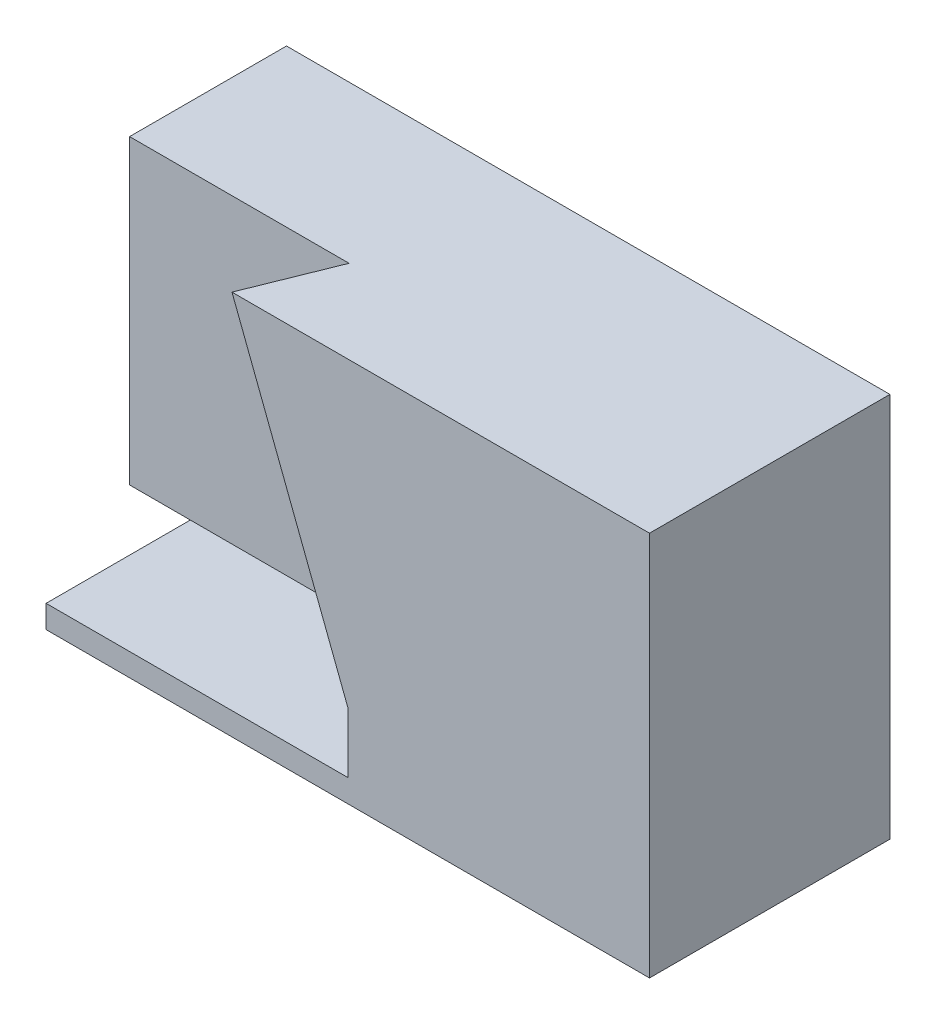
ISO-10303-21;
HEADER;
FILE_DESCRIPTION(('STEP AP214'),'2;1');
FILE_NAME('part.step','',(''),(''),'','','');
FILE_SCHEMA(('AUTOMOTIVE_DESIGN { 1 0 10303 214 1 1 1 1 }'));
ENDSEC;
DATA;
#1=APPLICATION_CONTEXT('core data for automotive mechanical design processes');
#2=APPLICATION_PROTOCOL_DEFINITION('international standard','automotive_design',2000,#1);
#3=PRODUCT_CONTEXT('',#1,'mechanical');
#4=PRODUCT('Part','Part','',(#3));
#5=PRODUCT_RELATED_PRODUCT_CATEGORY('part','',(#4));
#6=PRODUCT_DEFINITION_FORMATION('','',#4);
#7=PRODUCT_DEFINITION_CONTEXT('part definition',#1,'design');
#8=PRODUCT_DEFINITION('design','',#6,#7);
#9=PRODUCT_DEFINITION_SHAPE('','',#8);
#10=(LENGTH_UNIT() NAMED_UNIT(*) SI_UNIT(.MILLI.,.METRE.));
#11=(NAMED_UNIT(*) PLANE_ANGLE_UNIT() SI_UNIT($,.RADIAN.));
#12=(NAMED_UNIT(*) SI_UNIT($,.STERADIAN.) SOLID_ANGLE_UNIT());
#13=UNCERTAINTY_MEASURE_WITH_UNIT(LENGTH_MEASURE(1.E-05),#10,'distance_accuracy_value','');
#14=(GEOMETRIC_REPRESENTATION_CONTEXT(3) GLOBAL_UNCERTAINTY_ASSIGNED_CONTEXT((#13)) GLOBAL_UNIT_ASSIGNED_CONTEXT((#10,
#11,#12)) REPRESENTATION_CONTEXT('',''));
#15=CARTESIAN_POINT('',(0.,0.,0.));
#16=DIRECTION('',(0.,0.,1.));
#17=DIRECTION('',(1.,0.,0.));
#18=AXIS2_PLACEMENT_3D('',#15,#16,#17);
#19=CARTESIAN_POINT('',(-1345.55895524377,2408.42174870466,1104.9));
#20=DIRECTION('',(0.,0.,-1.));
#21=DIRECTION('',(-1.,0.,0.));
#22=AXIS2_PLACEMENT_3D('',#19,#20,#21);
#23=PLANE('',#22);
#24=DIRECTION('',(0.358367949545298,-0.933580426497203,0.));
#25=VECTOR('',#24,1.);
#26=CARTESIAN_POINT('',(-1345.55895524377,894.264248704664,1104.9));
#27=LINE('',#26,#25);
#28=CARTESIAN_POINT('',(-1926.7895628729,2408.42174870466,1104.9));
#29=VERTEX_POINT('',#28);
#30=CARTESIAN_POINT('',(-1345.55895524377,894.264248704664,1104.9));
#31=VERTEX_POINT('',#30);
#32=EDGE_CURVE('E143',#29,#31,#27,.T.);
#33=ORIENTED_EDGE('',*,*,#32,.F.);
#34=DIRECTION('',(1.,0.,0.));
#35=VECTOR('',#34,1.);
#36=CARTESIAN_POINT('',(-3028.315,2408.42174870466,1104.9));
#37=LINE('',#36,#35);
#38=CARTESIAN_POINT('',(-3028.315,2408.42174870466,1104.9));
#39=VERTEX_POINT('',#38);
#40=EDGE_CURVE('E149',#39,#29,#37,.T.);
#41=ORIENTED_EDGE('',*,*,#40,.F.);
#42=DIRECTION('',(0.,-1.,0.));
#43=VECTOR('',#42,1.);
#44=CARTESIAN_POINT('',(-3028.315,2408.42174870466,1104.9));
#45=LINE('',#44,#43);
#46=CARTESIAN_POINT('',(-3028.315,894.264248704664,1104.9));
#47=VERTEX_POINT('',#46);
#48=EDGE_CURVE('E161',#39,#47,#45,.T.);
#49=ORIENTED_EDGE('',*,*,#48,.T.);
#50=DIRECTION('',(1.,0.,0.));
#51=VECTOR('',#50,1.);
#52=CARTESIAN_POINT('',(-1345.55895524377,894.264248704664,1104.9));
#53=LINE('',#52,#51);
#54=EDGE_CURVE('E155',#47,#31,#53,.T.);
#55=ORIENTED_EDGE('',*,*,#54,.T.);
#56=EDGE_LOOP('',(#33,#41,#49,#55));
#57=FACE_BOUND('',#56,.T.);
#58=ADVANCED_FACE('F45',(#57),#23,.F.);
#59=CARTESIAN_POINT('',(-1514.1575,894.264248704664,1524.));
#60=DIRECTION('',(0.,0.,1.));
#61=DIRECTION('',(0.,-1.,0.));
#62=AXIS2_PLACEMENT_3D('',#59,#60,#61);
#63=PLANE('',#62);
#64=DIRECTION('',(-1.,0.,0.));
#65=VECTOR('',#64,1.);
#66=CARTESIAN_POINT('',(-2095.38810762913,2408.42174870466,1524.));
#67=LINE('',#66,#65);
#68=CARTESIAN_POINT('',(0.,2408.42174870466,1524.));
#69=VERTEX_POINT('',#68);
#70=CARTESIAN_POINT('',(-2095.38810762913,2408.42174870466,1524.));
#71=VERTEX_POINT('',#70);
#72=EDGE_CURVE('E124',#69,#71,#67,.T.);
#73=ORIENTED_EDGE('',*,*,#72,.T.);
#74=DIRECTION('',(0.358367949545298,-0.933580426497203,0.));
#75=VECTOR('',#74,1.);
#76=CARTESIAN_POINT('',(-1514.1575,894.264248704664,1524.));
#77=LINE('',#76,#75);
#78=CARTESIAN_POINT('',(-1514.1575,894.264248704664,1524.));
#79=VERTEX_POINT('',#78);
#80=EDGE_CURVE('E142',#71,#79,#77,.T.);
#81=ORIENTED_EDGE('',*,*,#80,.T.);
#82=DIRECTION('',(0.,-1.,0.));
#83=VECTOR('',#82,1.);
#84=CARTESIAN_POINT('',(-1514.1575,894.264248704664,1524.));
#85=LINE('',#84,#83);
#86=CARTESIAN_POINT('',(-1514.1575,589.464248704664,1524.));
#87=VERTEX_POINT('',#86);
#88=EDGE_CURVE('E209',#79,#87,#85,.T.);
#89=ORIENTED_EDGE('',*,*,#88,.T.);
#90=DIRECTION('',(1.,0.,0.));
#91=VECTOR('',#90,1.);
#92=CARTESIAN_POINT('',(-3028.315,589.464248704664,1524.));
#93=LINE('',#92,#91);
#94=CARTESIAN_POINT('',(-3028.315,589.464248704664,1524.));
#95=VERTEX_POINT('',#94);
#96=EDGE_CURVE('E131',#95,#87,#93,.T.);
#97=ORIENTED_EDGE('',*,*,#96,.F.);
#98=DIRECTION('',(0.,1.,0.));
#99=VECTOR('',#98,1.);
#100=CARTESIAN_POINT('',(-3028.315,589.464248704664,1524.));
#101=LINE('',#100,#99);
#102=CARTESIAN_POINT('',(-3028.315,475.164248704664,1524.));
#103=VERTEX_POINT('',#102);
#104=EDGE_CURVE('E192',#103,#95,#101,.T.);
#105=ORIENTED_EDGE('',*,*,#104,.F.);
#106=DIRECTION('',(1.,0.,0.));
#107=VECTOR('',#106,1.);
#108=CARTESIAN_POINT('',(-1514.1575,475.164248704664,1524.));
#109=LINE('',#108,#107);
#110=CARTESIAN_POINT('',(0.,475.164248704664,1524.));
#111=VERTEX_POINT('',#110);
#112=EDGE_CURVE('E70',#103,#111,#109,.T.);
#113=ORIENTED_EDGE('',*,*,#112,.T.);
#114=DIRECTION('',(0.,-1.,0.));
#115=VECTOR('',#114,1.);
#116=CARTESIAN_POINT('',(0.,894.264248704664,1524.));
#117=LINE('',#116,#115);
#118=EDGE_CURVE('E122',#69,#111,#117,.T.);
#119=ORIENTED_EDGE('',*,*,#118,.F.);
#120=EDGE_LOOP('',(#73,#81,#89,#97,#105,#113,#119));
#121=FACE_BOUND('',#120,.T.);
#122=ADVANCED_FACE('F47',(#121),#63,.T.);
#123=CARTESIAN_POINT('',(-1514.1575,894.264248704664,317.500000000001));
#124=DIRECTION('',(0.,0.,1.));
#125=DIRECTION('',(0.,-1.,0.));
#126=AXIS2_PLACEMENT_3D('',#123,#124,#125);
#127=PLANE('',#126);
#128=DIRECTION('',(0.,-1.,0.));
#129=VECTOR('',#128,1.);
#130=CARTESIAN_POINT('',(-1514.1575,894.264248704664,317.500000000001));
#131=LINE('',#130,#129);
#132=CARTESIAN_POINT('',(-1514.1575,1165.38781140894,317.5));
#133=VERTEX_POINT('',#132);
#134=CARTESIAN_POINT('',(-1514.1575,589.464248704664,317.500000000001));
#135=VERTEX_POINT('',#134);
#136=EDGE_CURVE('E214',#133,#135,#131,.T.);
#137=ORIENTED_EDGE('',*,*,#136,.F.);
#138=DIRECTION('',(-1.,0.,0.));
#139=VECTOR('',#138,1.);
#140=CARTESIAN_POINT('',(-587.649533141053,1165.38781140894,317.499999999999));
#141=LINE('',#140,#139);
#142=CARTESIAN_POINT('',(-3028.315,1165.38781140894,317.500000000001));
#143=VERTEX_POINT('',#142);
#144=EDGE_CURVE('E165',#133,#143,#141,.T.);
#145=ORIENTED_EDGE('',*,*,#144,.T.);
#146=DIRECTION('',(0.,-1.,0.));
#147=VECTOR('',#146,1.);
#148=CARTESIAN_POINT('',(-3028.315,2408.42174870466,317.500000000001));
#149=LINE('',#148,#147);
#150=CARTESIAN_POINT('',(-3028.315,2408.42174870466,317.500000000001));
#151=VERTEX_POINT('',#150);
#152=EDGE_CURVE('E169',#151,#143,#149,.T.);
#153=ORIENTED_EDGE('',*,*,#152,.F.);
#154=DIRECTION('',(-1.,0.,0.));
#155=VECTOR('',#154,1.);
#156=CARTESIAN_POINT('',(0.,2408.42174870466,317.500000000001));
#157=LINE('',#156,#155);
#158=CARTESIAN_POINT('',(0.,2408.42174870466,317.500000000001));
#159=VERTEX_POINT('',#158);
#160=EDGE_CURVE('E148',#159,#151,#157,.T.);
#161=ORIENTED_EDGE('',*,*,#160,.F.);
#162=DIRECTION('',(0.,-1.,0.));
#163=VECTOR('',#162,1.);
#164=CARTESIAN_POINT('',(0.,894.264248704664,317.500000000001));
#165=LINE('',#164,#163);
#166=CARTESIAN_POINT('',(0.,475.164248704664,317.500000000001));
#167=VERTEX_POINT('',#166);
#168=EDGE_CURVE('E146',#159,#167,#165,.T.);
#169=ORIENTED_EDGE('',*,*,#168,.T.);
#170=DIRECTION('',(1.,0.,0.));
#171=VECTOR('',#170,1.);
#172=CARTESIAN_POINT('',(-1514.1575,475.164248704664,317.500000000001));
#173=LINE('',#172,#171);
#174=CARTESIAN_POINT('',(-3028.315,475.164248704664,317.500000000001));
#175=VERTEX_POINT('',#174);
#176=EDGE_CURVE('E55',#175,#167,#173,.T.);
#177=ORIENTED_EDGE('',*,*,#176,.F.);
#178=DIRECTION('',(0.,-1.,0.));
#179=VECTOR('',#178,1.);
#180=CARTESIAN_POINT('',(-3028.315,589.464248704664,317.500000000001));
#181=LINE('',#180,#179);
#182=CARTESIAN_POINT('',(-3028.315,589.464248704664,317.500000000001));
#183=VERTEX_POINT('',#182);
#184=EDGE_CURVE('E181',#183,#175,#181,.T.);
#185=ORIENTED_EDGE('',*,*,#184,.F.);
#186=DIRECTION('',(1.,0.,0.));
#187=VECTOR('',#186,1.);
#188=CARTESIAN_POINT('',(-3028.315,589.464248704664,317.500000000001));
#189=LINE('',#188,#187);
#190=EDGE_CURVE('E198',#183,#135,#189,.T.);
#191=ORIENTED_EDGE('',*,*,#190,.T.);
#192=EDGE_LOOP('',(#137,#145,#153,#161,#169,#177,#185,#191));
#193=FACE_BOUND('',#192,.T.);
#194=ADVANCED_FACE('F244',(#193),#127,.F.);
#195=CARTESIAN_POINT('',(-1514.1575,475.164248704664,1524.));
#196=DIRECTION('',(0.,-1.,0.));
#197=DIRECTION('',(0.,0.,-1.));
#198=AXIS2_PLACEMENT_3D('',#195,#196,#197);
#199=PLANE('',#198);
#200=DIRECTION('',(0.,0.,-1.));
#201=VECTOR('',#200,1.);
#202=CARTESIAN_POINT('',(0.,475.164248704664,1524.));
#203=LINE('',#202,#201);
#204=EDGE_CURVE('E130',#111,#167,#203,.T.);
#205=ORIENTED_EDGE('',*,*,#204,.F.);
#206=ORIENTED_EDGE('',*,*,#112,.F.);
#207=DIRECTION('',(0.,0.,1.));
#208=VECTOR('',#207,1.);
#209=CARTESIAN_POINT('',(-3028.315,475.164248704664,317.500000000001));
#210=LINE('',#209,#208);
#211=EDGE_CURVE('E188',#175,#103,#210,.T.);
#212=ORIENTED_EDGE('',*,*,#211,.F.);
#213=ORIENTED_EDGE('',*,*,#176,.T.);
#214=EDGE_LOOP('',(#205,#206,#212,#213));
#215=FACE_BOUND('',#214,.T.);
#216=ADVANCED_FACE('F254',(#215),#199,.T.);
#217=CARTESIAN_POINT('',(0.,0.,0.));
#218=DIRECTION('',(1.,0.,0.));
#219=DIRECTION('',(0.,0.,-1.));
#220=AXIS2_PLACEMENT_3D('',#217,#218,#219);
#221=PLANE('',#220);
#222=ORIENTED_EDGE('',*,*,#118,.T.);
#223=ORIENTED_EDGE('',*,*,#204,.T.);
#224=ORIENTED_EDGE('',*,*,#168,.F.);
#225=DIRECTION('',(0.,0.,-1.));
#226=VECTOR('',#225,1.);
#227=CARTESIAN_POINT('',(0.,2408.42174870466,1104.9));
#228=LINE('',#227,#226);
#229=EDGE_CURVE('E136',#69,#159,#228,.T.);
#230=ORIENTED_EDGE('',*,*,#229,.F.);
#231=EDGE_LOOP('',(#222,#223,#224,#230));
#232=FACE_BOUND('',#231,.T.);
#233=ADVANCED_FACE('F145',(#232),#221,.T.);
#234=CARTESIAN_POINT('',(-3028.315,589.464248704664,317.500000000001));
#235=DIRECTION('',(0.,-1.,0.));
#236=DIRECTION('',(0.,0.,-1.));
#237=AXIS2_PLACEMENT_3D('',#234,#235,#236);
#238=PLANE('',#237);
#239=ORIENTED_EDGE('',*,*,#96,.T.);
#240=DIRECTION('',(0.373219169641667,0.,-0.927743203376875));
#241=VECTOR('',#240,1.);
#242=CARTESIAN_POINT('',(-1345.55895524377,589.464248704664,1104.9));
#243=LINE('',#242,#241);
#244=CARTESIAN_POINT('',(-1345.55895524377,589.464248704664,1104.9));
#245=VERTEX_POINT('',#244);
#246=EDGE_CURVE('E173',#87,#245,#243,.T.);
#247=ORIENTED_EDGE('',*,*,#246,.T.);
#248=DIRECTION('',(-0.209374701140831,0.,-0.977835484384867));
#249=VECTOR('',#248,1.);
#250=CARTESIAN_POINT('',(-1514.1575,589.464248704664,317.500000000001));
#251=LINE('',#250,#249);
#252=EDGE_CURVE('E178',#245,#135,#251,.T.);
#253=ORIENTED_EDGE('',*,*,#252,.T.);
#254=ORIENTED_EDGE('',*,*,#190,.F.);
#255=DIRECTION('',(0.,0.,-1.));
#256=VECTOR('',#255,1.);
#257=CARTESIAN_POINT('',(-3028.315,589.464248704664,317.500000000001));
#258=LINE('',#257,#256);
#259=EDGE_CURVE('E195',#95,#183,#258,.T.);
#260=ORIENTED_EDGE('',*,*,#259,.F.);
#261=EDGE_LOOP('',(#239,#247,#253,#254,#260));
#262=FACE_BOUND('',#261,.T.);
#263=ADVANCED_FACE('F262',(#262),#238,.F.);
#264=CARTESIAN_POINT('',(-3028.315,0.,0.));
#265=DIRECTION('',(-1.,0.,0.));
#266=DIRECTION('',(0.,0.,1.));
#267=AXIS2_PLACEMENT_3D('',#264,#265,#266);
#268=PLANE('',#267);
#269=ORIENTED_EDGE('',*,*,#184,.T.);
#270=ORIENTED_EDGE('',*,*,#211,.T.);
#271=ORIENTED_EDGE('',*,*,#104,.T.);
#272=ORIENTED_EDGE('',*,*,#259,.T.);
#273=EDGE_LOOP('',(#269,#270,#271,#272));
#274=FACE_BOUND('',#273,.T.);
#275=ADVANCED_FACE('F256',(#274),#268,.T.);
#276=CARTESIAN_POINT('',(-1345.55895524377,-628.758932528528,1104.9));
#277=DIRECTION('',(0.927743203376874,0.,0.373219169641667));
#278=DIRECTION('',(0.373219169641667,0.,-0.927743203376875));
#279=AXIS2_PLACEMENT_3D('',#276,#277,#278);
#280=PLANE('',#279);
#281=DIRECTION('',(0.,1.,0.));
#282=VECTOR('',#281,1.);
#283=CARTESIAN_POINT('',(-1345.55895524377,-628.758932528528,1104.9));
#284=LINE('',#283,#282);
#285=EDGE_CURVE('E177',#245,#31,#284,.T.);
#286=ORIENTED_EDGE('',*,*,#285,.F.);
#287=ORIENTED_EDGE('',*,*,#246,.F.);
#288=ORIENTED_EDGE('',*,*,#88,.F.);
#289=DIRECTION('',(-0.373219169641667,0.,0.927743203376875));
#290=VECTOR('',#289,1.);
#291=CARTESIAN_POINT('',(-1514.1575,894.264248704664,1524.));
#292=LINE('',#291,#290);
#293=EDGE_CURVE('E11',#31,#79,#292,.T.);
#294=ORIENTED_EDGE('',*,*,#293,.F.);
#295=EDGE_LOOP('',(#286,#287,#288,#294));
#296=FACE_BOUND('',#295,.T.);
#297=ADVANCED_FACE('F269',(#296),#280,.F.);
#298=CARTESIAN_POINT('',(-1514.1575,-628.758932528528,317.500000000001));
#299=DIRECTION('',(0.977835484384867,0.,-0.209374701140831));
#300=DIRECTION('',(-0.209374701140831,0.,-0.977835484384867));
#301=AXIS2_PLACEMENT_3D('',#298,#299,#300);
#302=PLANE('',#301);
#303=ORIENTED_EDGE('',*,*,#136,.T.);
#304=ORIENTED_EDGE('',*,*,#252,.F.);
#305=ORIENTED_EDGE('',*,*,#285,.T.);
#306=DIRECTION('',(-0.198429213322711,0.319094303799873,-0.926717148100004));
#307=VECTOR('',#306,1.);
#308=CARTESIAN_POINT('',(-1315.71691392523,846.275219070097,1244.27026187382));
#309=LINE('',#308,#307);
#310=EDGE_CURVE('E233',#31,#133,#309,.T.);
#311=ORIENTED_EDGE('',*,*,#310,.T.);
#312=EDGE_LOOP('',(#303,#304,#305,#311));
#313=FACE_BOUND('',#312,.T.);
#314=ADVANCED_FACE('F265',(#313),#302,.F.);
#315=CARTESIAN_POINT('',(-3028.315,2408.42174870466,317.500000000001));
#316=DIRECTION('',(1.,0.,0.));
#317=DIRECTION('',(0.,0.,-1.));
#318=AXIS2_PLACEMENT_3D('',#315,#316,#317);
#319=PLANE('',#318);
#320=ORIENTED_EDGE('',*,*,#152,.T.);
#321=DIRECTION('',(0.,0.32556815445715,-0.945518575599319));
#322=VECTOR('',#321,1.);
#323=CARTESIAN_POINT('',(-3028.315,894.264248704664,1104.9));
#324=LINE('',#323,#322);
#325=EDGE_CURVE('E228',#47,#143,#324,.T.);
#326=ORIENTED_EDGE('',*,*,#325,.F.);
#327=ORIENTED_EDGE('',*,*,#48,.F.);
#328=DIRECTION('',(0.,0.,1.));
#329=VECTOR('',#328,1.);
#330=CARTESIAN_POINT('',(-3028.315,2408.42174870466,317.500000000001));
#331=LINE('',#330,#329);
#332=EDGE_CURVE('E153',#151,#39,#331,.T.);
#333=ORIENTED_EDGE('',*,*,#332,.F.);
#334=EDGE_LOOP('',(#320,#326,#327,#333));
#335=FACE_BOUND('',#334,.T.);
#336=ADVANCED_FACE('F250',(#335),#319,.F.);
#337=CARTESIAN_POINT('',(0.,2408.42174870466,0.));
#338=DIRECTION('',(0.,1.,0.));
#339=DIRECTION('',(0.,0.,1.));
#340=AXIS2_PLACEMENT_3D('',#337,#338,#339);
#341=PLANE('',#340);
#342=ORIENTED_EDGE('',*,*,#72,.F.);
#343=ORIENTED_EDGE('',*,*,#229,.T.);
#344=ORIENTED_EDGE('',*,*,#160,.T.);
#345=ORIENTED_EDGE('',*,*,#332,.T.);
#346=ORIENTED_EDGE('',*,*,#40,.T.);
#347=DIRECTION('',(0.373219169641666,0.,-0.927743203376875));
#348=VECTOR('',#347,1.);
#349=CARTESIAN_POINT('',(-2095.38810762913,2408.42174870466,1524.));
#350=LINE('',#349,#348);
#351=EDGE_CURVE('E139',#71,#29,#350,.T.);
#352=ORIENTED_EDGE('',*,*,#351,.F.);
#353=EDGE_LOOP('',(#342,#343,#344,#345,#346,#352));
#354=FACE_BOUND('',#353,.T.);
#355=ADVANCED_FACE('F135',(#354),#341,.T.);
#356=CARTESIAN_POINT('',(-587.649533141052,894.264248704664,1104.9));
#357=DIRECTION('',(0.,0.945518575599319,0.32556815445715));
#358=DIRECTION('',(0.,-0.32556815445715,0.945518575599319));
#359=AXIS2_PLACEMENT_3D('',#356,#357,#358);
#360=PLANE('',#359);
#361=ORIENTED_EDGE('',*,*,#54,.F.);
#362=ORIENTED_EDGE('',*,*,#325,.T.);
#363=ORIENTED_EDGE('',*,*,#144,.F.);
#364=ORIENTED_EDGE('',*,*,#310,.F.);
#365=EDGE_LOOP('',(#361,#362,#363,#364));
#366=FACE_BOUND('',#365,.T.);
#367=ADVANCED_FACE('F267',(#366),#360,.F.);
#368=CARTESIAN_POINT('',(-1514.1575,894.264248704664,1524.));
#369=DIRECTION('',(0.873975448555186,0.335487742204279,0.351589092768017));
#370=DIRECTION('',(0.373219169641666,0.,-0.927743203376875));
#371=AXIS2_PLACEMENT_3D('',#368,#369,#370);
#372=PLANE('',#371);
#373=ORIENTED_EDGE('',*,*,#32,.T.);
#374=ORIENTED_EDGE('',*,*,#293,.T.);
#375=ORIENTED_EDGE('',*,*,#80,.F.);
#376=ORIENTED_EDGE('',*,*,#351,.T.);
#377=EDGE_LOOP('',(#373,#374,#375,#376));
#378=FACE_BOUND('',#377,.T.);
#379=ADVANCED_FACE('F270',(#378),#372,.F.);
#380=CLOSED_SHELL('',(#58,#122,#194,#216,#233,#263,#275,#297,#314,#336,#355,#367,#379));
#381=MANIFOLD_SOLID_BREP('B2',#380);
#382=ADVANCED_BREP_SHAPE_REPRESENTATION('',(#18,#381),#14);
#383=SHAPE_DEFINITION_REPRESENTATION(#9,#382);
ENDSEC;
END-ISO-10303-21;
